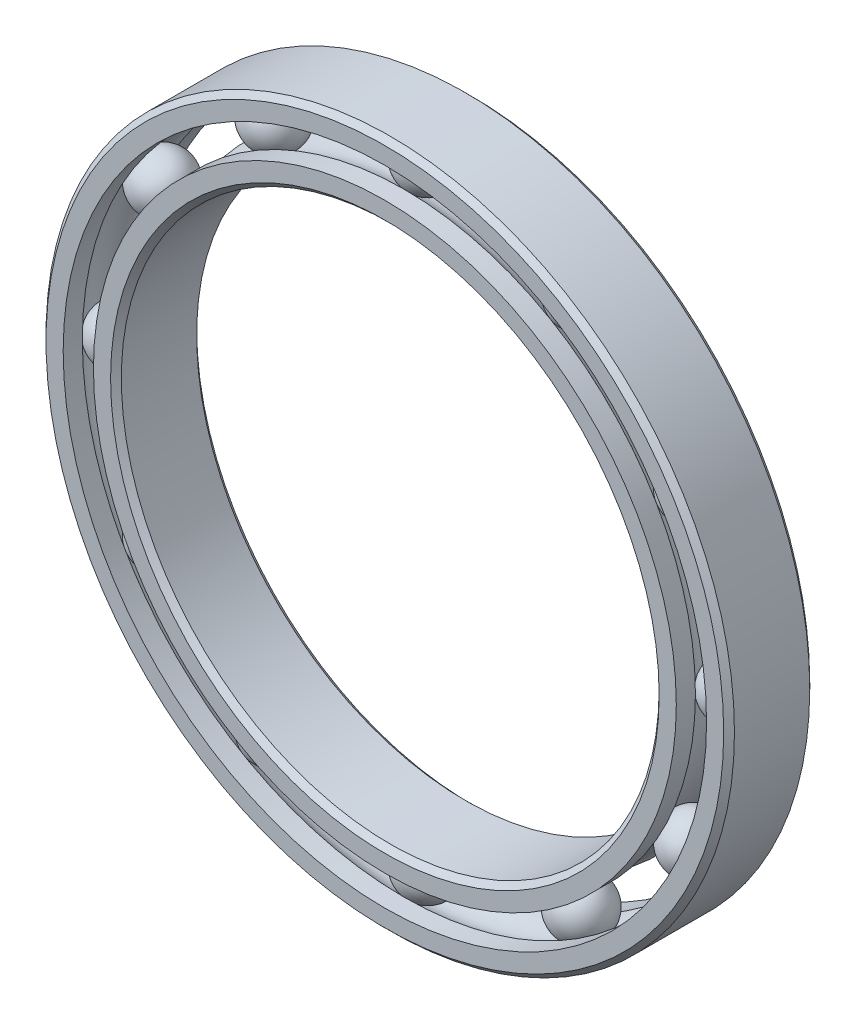
ISO-10303-21;
HEADER;
FILE_DESCRIPTION(('STEP AP214'),'2;1');
FILE_NAME('part.step','',(''),(''),'','','');
FILE_SCHEMA(('AUTOMOTIVE_DESIGN { 1 0 10303 214 1 1 1 1 }'));
ENDSEC;
DATA;
#1=APPLICATION_CONTEXT('core data for automotive mechanical design processes');
#2=APPLICATION_PROTOCOL_DEFINITION('international standard','automotive_design',2000,#1);
#3=PRODUCT_CONTEXT('',#1,'mechanical');
#4=PRODUCT('Part','Part','',(#3));
#5=PRODUCT_RELATED_PRODUCT_CATEGORY('part','',(#4));
#6=PRODUCT_DEFINITION_FORMATION('','',#4);
#7=PRODUCT_DEFINITION_CONTEXT('part definition',#1,'design');
#8=PRODUCT_DEFINITION('design','',#6,#7);
#9=PRODUCT_DEFINITION_SHAPE('','',#8);
#10=(LENGTH_UNIT() NAMED_UNIT(*) SI_UNIT(.MILLI.,.METRE.));
#11=(NAMED_UNIT(*) PLANE_ANGLE_UNIT() SI_UNIT($,.RADIAN.));
#12=(NAMED_UNIT(*) SI_UNIT($,.STERADIAN.) SOLID_ANGLE_UNIT());
#13=UNCERTAINTY_MEASURE_WITH_UNIT(LENGTH_MEASURE(1.E-05),#10,'distance_accuracy_value','');
#14=(GEOMETRIC_REPRESENTATION_CONTEXT(3) GLOBAL_UNCERTAINTY_ASSIGNED_CONTEXT((#13)) GLOBAL_UNIT_ASSIGNED_CONTEXT((#10,
#11,#12)) REPRESENTATION_CONTEXT('',''));
#15=CARTESIAN_POINT('',(0.,0.,0.));
#16=DIRECTION('',(0.,0.,1.));
#17=DIRECTION('',(1.,0.,0.));
#18=AXIS2_PLACEMENT_3D('',#15,#16,#17);
#19=CARTESIAN_POINT('',(-7.12499999999984,12.3408620039283,0.));
#20=DIRECTION('',(0.,0.,1.));
#21=DIRECTION('',(-0.499999999999989,0.866025403784445,0.));
#22=AXIS2_PLACEMENT_3D('',#19,#20,#21);
#23=SPHERICAL_SURFACE('',#22,1.31498827146959);
#24=CARTESIAN_POINT('',(-7.12499999999984,12.3408620039283,1.31498827146959));
#25=VERTEX_POINT('',#24);
#26=VERTEX_LOOP('',#25);
#27=FACE_BOUND('',#26,.T.);
#28=ADVANCED_FACE('F43',(#27),#23,.T.);
#29=CLOSED_SHELL('',(#28));
#30=MANIFOLD_SOLID_BREP('B2',#29);
#31=CARTESIAN_POINT('',(-12.3408620039282,7.12500000000014,0.));
#32=DIRECTION('',(0.,0.,1.));
#33=DIRECTION('',(-0.866025403784433,0.50000000000001,0.));
#34=AXIS2_PLACEMENT_3D('',#31,#32,#33);
#35=SPHERICAL_SURFACE('',#34,1.31498827146959);
#36=CARTESIAN_POINT('',(-12.3408620039282,7.12500000000014,1.31498827146959));
#37=VERTEX_POINT('',#36);
#38=VERTEX_LOOP('',#37);
#39=FACE_BOUND('',#38,.T.);
#40=ADVANCED_FACE('F64',(#39),#35,.T.);
#41=CLOSED_SHELL('',(#40));
#42=MANIFOLD_SOLID_BREP('B6',#41);
#43=CARTESIAN_POINT('',(-14.25,1.49260827235544E-13,0.));
#44=DIRECTION('',(0.,0.,1.));
#45=DIRECTION('',(-1.,0.,0.));
#46=AXIS2_PLACEMENT_3D('',#43,#44,#45);
#47=SPHERICAL_SURFACE('',#46,1.31498827146959);
#48=CARTESIAN_POINT('',(-14.25,1.49260827235544E-13,1.31498827146959));
#49=VERTEX_POINT('',#48);
#50=VERTEX_LOOP('',#49);
#51=FACE_BOUND('',#50,.T.);
#52=ADVANCED_FACE('F89',(#51),#47,.T.);
#53=CLOSED_SHELL('',(#52));
#54=MANIFOLD_SOLID_BREP('B39',#53);
#55=CARTESIAN_POINT('',(-12.3408620039283,-7.12499999999989,0.));
#56=DIRECTION('',(0.,0.,1.));
#57=DIRECTION('',(-0.866025403784443,-0.499999999999992,0.));
#58=AXIS2_PLACEMENT_3D('',#55,#56,#57);
#59=SPHERICAL_SURFACE('',#58,1.31498827146959);
#60=CARTESIAN_POINT('',(-12.3408620039283,-7.12499999999989,1.31498827146959));
#61=VERTEX_POINT('',#60);
#62=VERTEX_LOOP('',#61);
#63=FACE_BOUND('',#62,.T.);
#64=ADVANCED_FACE('F112',(#63),#59,.T.);
#65=CLOSED_SHELL('',(#64));
#66=MANIFOLD_SOLID_BREP('B60',#65);
#67=CARTESIAN_POINT('',(-7.1250000000001,-12.3408620039282,0.));
#68=DIRECTION('',(0.,0.,1.));
#69=DIRECTION('',(-0.500000000000007,-0.866025403784435,0.));
#70=AXIS2_PLACEMENT_3D('',#67,#68,#69);
#71=SPHERICAL_SURFACE('',#70,1.31498827146959);
#72=CARTESIAN_POINT('',(-7.1250000000001,-12.3408620039282,1.31498827146959));
#73=VERTEX_POINT('',#72);
#74=VERTEX_LOOP('',#73);
#75=FACE_BOUND('',#74,.T.);
#76=ADVANCED_FACE('F132',(#75),#71,.T.);
#77=CLOSED_SHELL('',(#76));
#78=MANIFOLD_SOLID_BREP('B85',#77);
#79=CARTESIAN_POINT('',(0.,-14.25,0.));
#80=DIRECTION('',(0.,0.,1.));
#81=DIRECTION('',(0.,-1.,0.));
#82=AXIS2_PLACEMENT_3D('',#79,#80,#81);
#83=SPHERICAL_SURFACE('',#82,1.31498827146959);
#84=CARTESIAN_POINT('',(0.,-14.25,1.31498827146959));
#85=VERTEX_POINT('',#84);
#86=VERTEX_LOOP('',#85);
#87=FACE_BOUND('',#86,.T.);
#88=ADVANCED_FACE('F152',(#87),#83,.T.);
#89=CLOSED_SHELL('',(#88));
#90=MANIFOLD_SOLID_BREP('B108',#89);
#91=CARTESIAN_POINT('',(7.12499999999993,-12.3408620039283,0.));
#92=DIRECTION('',(0.,0.,1.));
#93=DIRECTION('',(0.499999999999995,-0.866025403784442,0.));
#94=AXIS2_PLACEMENT_3D('',#91,#92,#93);
#95=SPHERICAL_SURFACE('',#94,1.31498827146959);
#96=CARTESIAN_POINT('',(7.12499999999993,-12.3408620039283,1.31498827146959));
#97=VERTEX_POINT('',#96);
#98=VERTEX_LOOP('',#97);
#99=FACE_BOUND('',#98,.T.);
#100=ADVANCED_FACE('F172',(#99),#95,.T.);
#101=CLOSED_SHELL('',(#100));
#102=MANIFOLD_SOLID_BREP('B128',#101);
#103=CARTESIAN_POINT('',(12.3408620039282,-7.12500000000006,0.));
#104=DIRECTION('',(0.,0.,1.));
#105=DIRECTION('',(0.866025403784436,-0.500000000000004,0.));
#106=AXIS2_PLACEMENT_3D('',#103,#104,#105);
#107=SPHERICAL_SURFACE('',#106,1.31498827146959);
#108=CARTESIAN_POINT('',(12.3408620039282,-7.12500000000006,1.31498827146959));
#109=VERTEX_POINT('',#108);
#110=VERTEX_LOOP('',#109);
#111=FACE_BOUND('',#110,.T.);
#112=ADVANCED_FACE('F192',(#111),#107,.T.);
#113=CLOSED_SHELL('',(#112));
#114=MANIFOLD_SOLID_BREP('B148',#113);
#115=CARTESIAN_POINT('',(14.25,0.,0.));
#116=DIRECTION('',(0.,0.,1.));
#117=DIRECTION('',(1.,0.,0.));
#118=AXIS2_PLACEMENT_3D('',#115,#116,#117);
#119=SPHERICAL_SURFACE('',#118,1.31498827146959);
#120=CARTESIAN_POINT('',(14.25,0.,1.31498827146959));
#121=VERTEX_POINT('',#120);
#122=VERTEX_LOOP('',#121);
#123=FACE_BOUND('',#122,.T.);
#124=ADVANCED_FACE('F212',(#123),#119,.T.);
#125=CLOSED_SHELL('',(#124));
#126=MANIFOLD_SOLID_BREP('B168',#125);
#127=CARTESIAN_POINT('',(12.3408620039283,7.12499999999997,0.));
#128=DIRECTION('',(0.,0.,1.));
#129=DIRECTION('',(0.86602540378444,0.499999999999998,0.));
#130=AXIS2_PLACEMENT_3D('',#127,#128,#129);
#131=SPHERICAL_SURFACE('',#130,1.31498827146959);
#132=CARTESIAN_POINT('',(12.3408620039283,7.12499999999997,1.31498827146959));
#133=VERTEX_POINT('',#132);
#134=VERTEX_LOOP('',#133);
#135=FACE_BOUND('',#134,.T.);
#136=ADVANCED_FACE('F232',(#135),#131,.T.);
#137=CLOSED_SHELL('',(#136));
#138=MANIFOLD_SOLID_BREP('B188',#137);
#139=CARTESIAN_POINT('',(7.12500000000001,12.3408620039282,0.));
#140=DIRECTION('',(0.,0.,1.));
#141=DIRECTION('',(0.500000000000001,0.866025403784438,0.));
#142=AXIS2_PLACEMENT_3D('',#139,#140,#141);
#143=SPHERICAL_SURFACE('',#142,1.31498827146959);
#144=CARTESIAN_POINT('',(7.12500000000001,12.3408620039282,1.31498827146959));
#145=VERTEX_POINT('',#144);
#146=VERTEX_LOOP('',#145);
#147=FACE_BOUND('',#146,.T.);
#148=ADVANCED_FACE('F252',(#147),#143,.T.);
#149=CLOSED_SHELL('',(#148));
#150=MANIFOLD_SOLID_BREP('B208',#149);
#151=CARTESIAN_POINT('',(0.,14.25,0.));
#152=DIRECTION('',(0.,0.,1.));
#153=DIRECTION('',(0.,1.,0.));
#154=AXIS2_PLACEMENT_3D('',#151,#152,#153);
#155=SPHERICAL_SURFACE('',#154,1.31498827146959);
#156=CARTESIAN_POINT('',(0.,14.25,1.31498827146959));
#157=VERTEX_POINT('',#156);
#158=VERTEX_LOOP('',#157);
#159=FACE_BOUND('',#158,.T.);
#160=ADVANCED_FACE('F274',(#159),#155,.T.);
#161=CLOSED_SHELL('',(#160));
#162=MANIFOLD_SOLID_BREP('B228',#161);
#163=CARTESIAN_POINT('',(0.,13.5467032967033,2.));
#164=DIRECTION('',(0.,0.,-1.));
#165=DIRECTION('',(-1.,0.,0.));
#166=AXIS2_PLACEMENT_3D('',#163,#164,#165);
#167=PLANE('',#166);
#168=CARTESIAN_POINT('',(0.,0.,2.));
#169=DIRECTION('',(0.,0.,1.));
#170=DIRECTION('',(1.,0.,0.));
#171=AXIS2_PLACEMENT_3D('',#168,#169,#170);
#172=CIRCLE('',#171,12.75);
#173=CARTESIAN_POINT('',(12.75,0.,2.));
#174=VERTEX_POINT('',#173);
#175=EDGE_CURVE('E330',#174,#174,#172,.T.);
#176=ORIENTED_EDGE('',*,*,#175,.F.);
#177=EDGE_LOOP('',(#176));
#178=FACE_BOUND('',#177,.T.);
#179=CARTESIAN_POINT('',(0.,0.,2.));
#180=DIRECTION('',(0.,0.,1.));
#181=DIRECTION('',(1.,0.,0.));
#182=AXIS2_PLACEMENT_3D('',#179,#180,#181);
#183=CIRCLE('',#182,13.5467032967033);
#184=CARTESIAN_POINT('',(13.5467032967033,0.,2.));
#185=VERTEX_POINT('',#184);
#186=EDGE_CURVE('E273',#185,#185,#183,.T.);
#187=ORIENTED_EDGE('',*,*,#186,.T.);
#188=EDGE_LOOP('',(#187));
#189=FACE_BOUND('',#188,.T.);
#190=ADVANCED_FACE('F293',(#178,#189),#167,.F.);
#191=CARTESIAN_POINT('',(0.,0.,2.));
#192=DIRECTION('',(0.,0.,1.));
#193=DIRECTION('',(1.,0.,0.));
#194=AXIS2_PLACEMENT_3D('',#191,#192,#193);
#195=CYLINDRICAL_SURFACE('',#194,13.5467032967033);
#196=ORIENTED_EDGE('',*,*,#186,.F.);
#197=EDGE_LOOP('',(#196));
#198=FACE_BOUND('',#197,.T.);
#199=CARTESIAN_POINT('',(0.,0.,1.11111111111111));
#200=DIRECTION('',(0.,0.,1.));
#201=DIRECTION('',(1.,0.,0.));
#202=AXIS2_PLACEMENT_3D('',#199,#200,#201);
#203=CIRCLE('',#202,13.5467032967033);
#204=CARTESIAN_POINT('',(13.5467032967033,0.,1.11111111111111));
#205=VERTEX_POINT('',#204);
#206=EDGE_CURVE('E300',#205,#205,#203,.T.);
#207=ORIENTED_EDGE('',*,*,#206,.T.);
#208=EDGE_LOOP('',(#207));
#209=FACE_BOUND('',#208,.T.);
#210=ADVANCED_FACE('F338',(#198,#209),#195,.T.);
#211=CARTESIAN_POINT('',(0.,0.,0.));
#212=DIRECTION('',(0.,0.,1.));
#213=DIRECTION('',(1.,0.,0.));
#214=AXIS2_PLACEMENT_3D('',#211,#212,#213);
#215=TOROIDAL_SURFACE('',#214,14.25,1.31498827146959);
#216=ORIENTED_EDGE('',*,*,#206,.F.);
#217=EDGE_LOOP('',(#216));
#218=FACE_BOUND('',#217,.T.);
#219=CARTESIAN_POINT('',(0.,0.,-1.11111111111111));
#220=DIRECTION('',(0.,0.,1.));
#221=DIRECTION('',(1.,0.,0.));
#222=AXIS2_PLACEMENT_3D('',#219,#220,#221);
#223=CIRCLE('',#222,13.5467032967033);
#224=CARTESIAN_POINT('',(13.5467032967033,0.,-1.11111111111111));
#225=VERTEX_POINT('',#224);
#226=EDGE_CURVE('E307',#225,#225,#223,.T.);
#227=ORIENTED_EDGE('',*,*,#226,.T.);
#228=EDGE_LOOP('',(#227));
#229=FACE_BOUND('',#228,.T.);
#230=ADVANCED_FACE('F342',(#218,#229),#215,.F.);
#231=CARTESIAN_POINT('',(0.,0.,2.));
#232=DIRECTION('',(0.,0.,1.));
#233=DIRECTION('',(1.,0.,0.));
#234=AXIS2_PLACEMENT_3D('',#231,#232,#233);
#235=CYLINDRICAL_SURFACE('',#234,13.5467032967033);
#236=ORIENTED_EDGE('',*,*,#226,.F.);
#237=EDGE_LOOP('',(#236));
#238=FACE_BOUND('',#237,.T.);
#239=CARTESIAN_POINT('',(0.,0.,-2.));
#240=DIRECTION('',(0.,0.,1.));
#241=DIRECTION('',(1.,0.,0.));
#242=AXIS2_PLACEMENT_3D('',#239,#240,#241);
#243=CIRCLE('',#242,13.5467032967033);
#244=CARTESIAN_POINT('',(13.5467032967033,0.,-2.));
#245=VERTEX_POINT('',#244);
#246=EDGE_CURVE('E313',#245,#245,#243,.T.);
#247=ORIENTED_EDGE('',*,*,#246,.T.);
#248=EDGE_LOOP('',(#247));
#249=FACE_BOUND('',#248,.T.);
#250=ADVANCED_FACE('F347',(#238,#249),#235,.T.);
#251=CARTESIAN_POINT('',(0.,12.75,-2.));
#252=DIRECTION('',(0.,0.,1.));
#253=DIRECTION('',(1.,0.,0.));
#254=AXIS2_PLACEMENT_3D('',#251,#252,#253);
#255=PLANE('',#254);
#256=ORIENTED_EDGE('',*,*,#246,.F.);
#257=EDGE_LOOP('',(#256));
#258=FACE_BOUND('',#257,.T.);
#259=CARTESIAN_POINT('',(0.,0.,-2.));
#260=DIRECTION('',(0.,0.,1.));
#261=DIRECTION('',(1.,0.,0.));
#262=AXIS2_PLACEMENT_3D('',#259,#260,#261);
#263=CIRCLE('',#262,12.75);
#264=CARTESIAN_POINT('',(12.75,0.,-2.));
#265=VERTEX_POINT('',#264);
#266=EDGE_CURVE('E319',#265,#265,#263,.T.);
#267=ORIENTED_EDGE('',*,*,#266,.T.);
#268=EDGE_LOOP('',(#267));
#269=FACE_BOUND('',#268,.T.);
#270=ADVANCED_FACE('F353',(#258,#269),#255,.F.);
#271=CARTESIAN_POINT('',(0.,0.,-1.75));
#272=DIRECTION('',(0.,0.,-1.));
#273=DIRECTION('',(-1.,0.,0.));
#274=AXIS2_PLACEMENT_3D('',#271,#272,#273);
#275=CONICAL_SURFACE('',#274,12.5,0.785398163397448);
#276=ORIENTED_EDGE('',*,*,#266,.F.);
#277=EDGE_LOOP('',(#276));
#278=FACE_BOUND('',#277,.T.);
#279=CARTESIAN_POINT('',(0.,0.,-1.75));
#280=DIRECTION('',(0.,0.,1.));
#281=DIRECTION('',(1.,0.,0.));
#282=AXIS2_PLACEMENT_3D('',#279,#280,#281);
#283=CIRCLE('',#282,12.5);
#284=CARTESIAN_POINT('',(12.5,0.,-1.75));
#285=VERTEX_POINT('',#284);
#286=EDGE_CURVE('E322',#285,#285,#283,.T.);
#287=ORIENTED_EDGE('',*,*,#286,.T.);
#288=EDGE_LOOP('',(#287));
#289=FACE_BOUND('',#288,.T.);
#290=ADVANCED_FACE('F357',(#278,#289),#275,.F.);
#291=CARTESIAN_POINT('',(0.,0.,2.));
#292=DIRECTION('',(0.,0.,1.));
#293=DIRECTION('',(1.,0.,0.));
#294=AXIS2_PLACEMENT_3D('',#291,#292,#293);
#295=CYLINDRICAL_SURFACE('',#294,12.5);
#296=ORIENTED_EDGE('',*,*,#286,.F.);
#297=EDGE_LOOP('',(#296));
#298=FACE_BOUND('',#297,.T.);
#299=CARTESIAN_POINT('',(0.,0.,1.75));
#300=DIRECTION('',(0.,0.,1.));
#301=DIRECTION('',(1.,0.,0.));
#302=AXIS2_PLACEMENT_3D('',#299,#300,#301);
#303=CIRCLE('',#302,12.5);
#304=CARTESIAN_POINT('',(12.5,0.,1.75));
#305=VERTEX_POINT('',#304);
#306=EDGE_CURVE('E326',#305,#305,#303,.T.);
#307=ORIENTED_EDGE('',*,*,#306,.T.);
#308=EDGE_LOOP('',(#307));
#309=FACE_BOUND('',#308,.T.);
#310=ADVANCED_FACE('F361',(#298,#309),#295,.F.);
#311=CARTESIAN_POINT('',(0.,0.,2.));
#312=DIRECTION('',(0.,0.,1.));
#313=DIRECTION('',(1.,0.,0.));
#314=AXIS2_PLACEMENT_3D('',#311,#312,#313);
#315=CONICAL_SURFACE('',#314,12.75,0.785398163397449);
#316=ORIENTED_EDGE('',*,*,#306,.F.);
#317=EDGE_LOOP('',(#316));
#318=FACE_BOUND('',#317,.T.);
#319=ORIENTED_EDGE('',*,*,#175,.T.);
#320=EDGE_LOOP('',(#319));
#321=FACE_BOUND('',#320,.T.);
#322=ADVANCED_FACE('F335',(#318,#321),#315,.F.);
#323=CLOSED_SHELL('',(#190,#210,#230,#250,#270,#290,#310,#322));
#324=MANIFOLD_SOLID_BREP('B248',#323);
#325=CARTESIAN_POINT('',(0.,0.,1.75));
#326=DIRECTION('',(0.,0.,-1.));
#327=DIRECTION('',(-1.,0.,0.));
#328=AXIS2_PLACEMENT_3D('',#325,#326,#327);
#329=CONICAL_SURFACE('',#328,16.,0.785398163397449);
#330=CARTESIAN_POINT('',(0.,0.,2.));
#331=DIRECTION('',(0.,0.,1.));
#332=DIRECTION('',(1.,0.,0.));
#333=AXIS2_PLACEMENT_3D('',#330,#331,#332);
#334=CIRCLE('',#333,15.75);
#335=CARTESIAN_POINT('',(15.75,0.,2.));
#336=VERTEX_POINT('',#335);
#337=EDGE_CURVE('E470',#336,#336,#334,.T.);
#338=ORIENTED_EDGE('',*,*,#337,.F.);
#339=EDGE_LOOP('',(#338));
#340=FACE_BOUND('',#339,.T.);
#341=CARTESIAN_POINT('',(0.,0.,1.75));
#342=DIRECTION('',(0.,0.,1.));
#343=DIRECTION('',(1.,0.,0.));
#344=AXIS2_PLACEMENT_3D('',#341,#342,#343);
#345=CIRCLE('',#344,16.);
#346=CARTESIAN_POINT('',(16.,0.,1.75));
#347=VERTEX_POINT('',#346);
#348=EDGE_CURVE('E292',#347,#347,#345,.T.);
#349=ORIENTED_EDGE('',*,*,#348,.T.);
#350=EDGE_LOOP('',(#349));
#351=FACE_BOUND('',#350,.T.);
#352=ADVANCED_FACE('F434',(#340,#351),#329,.T.);
#353=CARTESIAN_POINT('',(0.,0.,2.));
#354=DIRECTION('',(0.,0.,1.));
#355=DIRECTION('',(1.,0.,0.));
#356=AXIS2_PLACEMENT_3D('',#353,#354,#355);
#357=CYLINDRICAL_SURFACE('',#356,16.);
#358=ORIENTED_EDGE('',*,*,#348,.F.);
#359=EDGE_LOOP('',(#358));
#360=FACE_BOUND('',#359,.T.);
#361=CARTESIAN_POINT('',(0.,0.,-1.75));
#362=DIRECTION('',(0.,0.,1.));
#363=DIRECTION('',(1.,0.,0.));
#364=AXIS2_PLACEMENT_3D('',#361,#362,#363);
#365=CIRCLE('',#364,16.);
#366=CARTESIAN_POINT('',(16.,0.,-1.75));
#367=VERTEX_POINT('',#366);
#368=EDGE_CURVE('E441',#367,#367,#365,.T.);
#369=ORIENTED_EDGE('',*,*,#368,.T.);
#370=EDGE_LOOP('',(#369));
#371=FACE_BOUND('',#370,.T.);
#372=ADVANCED_FACE('F477',(#360,#371),#357,.T.);
#373=CARTESIAN_POINT('',(0.,0.,-2.));
#374=DIRECTION('',(0.,0.,1.));
#375=DIRECTION('',(1.,0.,0.));
#376=AXIS2_PLACEMENT_3D('',#373,#374,#375);
#377=CONICAL_SURFACE('',#376,15.75,0.785398163397448);
#378=ORIENTED_EDGE('',*,*,#368,.F.);
#379=EDGE_LOOP('',(#378));
#380=FACE_BOUND('',#379,.T.);
#381=CARTESIAN_POINT('',(0.,0.,-2.));
#382=DIRECTION('',(0.,0.,1.));
#383=DIRECTION('',(1.,0.,0.));
#384=AXIS2_PLACEMENT_3D('',#381,#382,#383);
#385=CIRCLE('',#384,15.75);
#386=CARTESIAN_POINT('',(15.75,0.,-2.));
#387=VERTEX_POINT('',#386);
#388=EDGE_CURVE('E448',#387,#387,#385,.T.);
#389=ORIENTED_EDGE('',*,*,#388,.T.);
#390=EDGE_LOOP('',(#389));
#391=FACE_BOUND('',#390,.T.);
#392=ADVANCED_FACE('F481',(#380,#391),#377,.T.);
#393=CARTESIAN_POINT('',(0.,15.75,-2.));
#394=DIRECTION('',(0.,0.,1.));
#395=DIRECTION('',(1.,0.,0.));
#396=AXIS2_PLACEMENT_3D('',#393,#394,#395);
#397=PLANE('',#396);
#398=ORIENTED_EDGE('',*,*,#388,.F.);
#399=EDGE_LOOP('',(#398));
#400=FACE_BOUND('',#399,.T.);
#401=CARTESIAN_POINT('',(0.,0.,-2.));
#402=DIRECTION('',(0.,0.,1.));
#403=DIRECTION('',(1.,0.,0.));
#404=AXIS2_PLACEMENT_3D('',#401,#402,#403);
#405=CIRCLE('',#404,14.9532967032967);
#406=CARTESIAN_POINT('',(14.9532967032967,0.,-2.));
#407=VERTEX_POINT('',#406);
#408=EDGE_CURVE('E454',#407,#407,#405,.T.);
#409=ORIENTED_EDGE('',*,*,#408,.T.);
#410=EDGE_LOOP('',(#409));
#411=FACE_BOUND('',#410,.T.);
#412=ADVANCED_FACE('F486',(#400,#411),#397,.F.);
#413=CARTESIAN_POINT('',(0.,0.,2.));
#414=DIRECTION('',(0.,0.,1.));
#415=DIRECTION('',(1.,0.,0.));
#416=AXIS2_PLACEMENT_3D('',#413,#414,#415);
#417=CYLINDRICAL_SURFACE('',#416,14.9532967032967);
#418=ORIENTED_EDGE('',*,*,#408,.F.);
#419=EDGE_LOOP('',(#418));
#420=FACE_BOUND('',#419,.T.);
#421=CARTESIAN_POINT('',(0.,0.,-1.11111111111111));
#422=DIRECTION('',(0.,0.,1.));
#423=DIRECTION('',(1.,0.,0.));
#424=AXIS2_PLACEMENT_3D('',#421,#422,#423);
#425=CIRCLE('',#424,14.9532967032967);
#426=CARTESIAN_POINT('',(14.9532967032967,0.,-1.11111111111111));
#427=VERTEX_POINT('',#426);
#428=EDGE_CURVE('E460',#427,#427,#425,.T.);
#429=ORIENTED_EDGE('',*,*,#428,.T.);
#430=EDGE_LOOP('',(#429));
#431=FACE_BOUND('',#430,.T.);
#432=ADVANCED_FACE('F492',(#420,#431),#417,.F.);
#433=CARTESIAN_POINT('',(0.,0.,0.));
#434=DIRECTION('',(0.,0.,1.));
#435=DIRECTION('',(1.,0.,0.));
#436=AXIS2_PLACEMENT_3D('',#433,#434,#435);
#437=TOROIDAL_SURFACE('',#436,14.25,1.31498827146959);
#438=ORIENTED_EDGE('',*,*,#428,.F.);
#439=EDGE_LOOP('',(#438));
#440=FACE_BOUND('',#439,.T.);
#441=CARTESIAN_POINT('',(0.,0.,1.11111111111111));
#442=DIRECTION('',(0.,0.,1.));
#443=DIRECTION('',(1.,0.,0.));
#444=AXIS2_PLACEMENT_3D('',#441,#442,#443);
#445=CIRCLE('',#444,14.9532967032967);
#446=CARTESIAN_POINT('',(14.9532967032967,0.,1.11111111111111));
#447=VERTEX_POINT('',#446);
#448=EDGE_CURVE('E463',#447,#447,#445,.T.);
#449=ORIENTED_EDGE('',*,*,#448,.T.);
#450=EDGE_LOOP('',(#449));
#451=FACE_BOUND('',#450,.T.);
#452=ADVANCED_FACE('F496',(#440,#451),#437,.F.);
#453=CARTESIAN_POINT('',(0.,0.,2.));
#454=DIRECTION('',(0.,0.,1.));
#455=DIRECTION('',(1.,0.,0.));
#456=AXIS2_PLACEMENT_3D('',#453,#454,#455);
#457=CYLINDRICAL_SURFACE('',#456,14.9532967032967);
#458=ORIENTED_EDGE('',*,*,#448,.F.);
#459=EDGE_LOOP('',(#458));
#460=FACE_BOUND('',#459,.T.);
#461=CARTESIAN_POINT('',(0.,0.,2.));
#462=DIRECTION('',(0.,0.,1.));
#463=DIRECTION('',(1.,0.,0.));
#464=AXIS2_PLACEMENT_3D('',#461,#462,#463);
#465=CIRCLE('',#464,14.9532967032967);
#466=CARTESIAN_POINT('',(14.9532967032967,0.,2.));
#467=VERTEX_POINT('',#466);
#468=EDGE_CURVE('E466',#467,#467,#465,.T.);
#469=ORIENTED_EDGE('',*,*,#468,.T.);
#470=EDGE_LOOP('',(#469));
#471=FACE_BOUND('',#470,.T.);
#472=ADVANCED_FACE('F500',(#460,#471),#457,.F.);
#473=CARTESIAN_POINT('',(0.,15.75,2.));
#474=DIRECTION('',(0.,0.,-1.));
#475=DIRECTION('',(-1.,0.,0.));
#476=AXIS2_PLACEMENT_3D('',#473,#474,#475);
#477=PLANE('',#476);
#478=ORIENTED_EDGE('',*,*,#468,.F.);
#479=EDGE_LOOP('',(#478));
#480=FACE_BOUND('',#479,.T.);
#481=ORIENTED_EDGE('',*,*,#337,.T.);
#482=EDGE_LOOP('',(#481));
#483=FACE_BOUND('',#482,.T.);
#484=ADVANCED_FACE('F474',(#480,#483),#477,.F.);
#485=CLOSED_SHELL('',(#352,#372,#392,#412,#432,#452,#472,#484));
#486=MANIFOLD_SOLID_BREP('B268',#485);
#487=ADVANCED_BREP_SHAPE_REPRESENTATION('',(#18,#30,#42,#54,#66,#78,#90,#102,#114,#126,#138,
#150,#162,#324,#486),#14);
#488=SHAPE_DEFINITION_REPRESENTATION(#9,#487);
ENDSEC;
END-ISO-10303-21;
